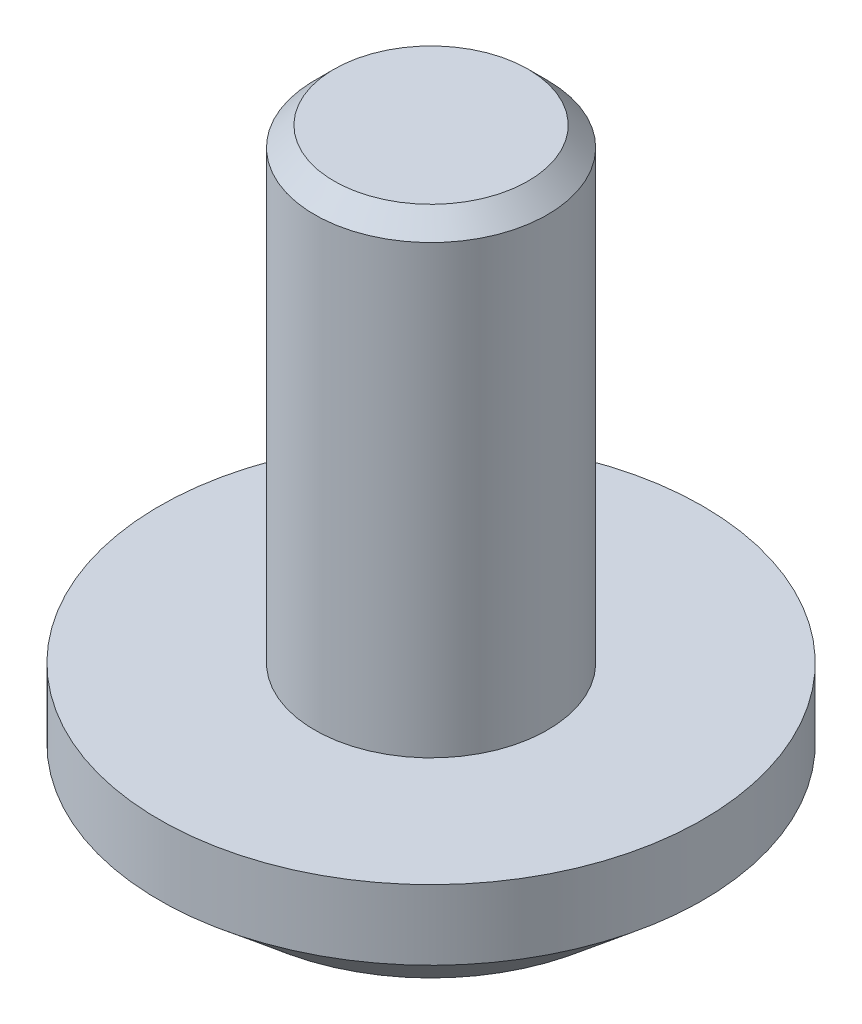
ISO-10303-21;
HEADER;
FILE_DESCRIPTION(('STEP AP214'),'2;1');
FILE_NAME('part.step','',(''),(''),'','','');
FILE_SCHEMA(('AUTOMOTIVE_DESIGN { 1 0 10303 214 1 1 1 1 }'));
ENDSEC;
DATA;
#1=APPLICATION_CONTEXT('core data for automotive mechanical design processes');
#2=APPLICATION_PROTOCOL_DEFINITION('international standard','automotive_design',2000,#1);
#3=PRODUCT_CONTEXT('',#1,'mechanical');
#4=PRODUCT('Part','Part','',(#3));
#5=PRODUCT_RELATED_PRODUCT_CATEGORY('part','',(#4));
#6=PRODUCT_DEFINITION_FORMATION('','',#4);
#7=PRODUCT_DEFINITION_CONTEXT('part definition',#1,'design');
#8=PRODUCT_DEFINITION('design','',#6,#7);
#9=PRODUCT_DEFINITION_SHAPE('','',#8);
#10=(LENGTH_UNIT() NAMED_UNIT(*) SI_UNIT(.MILLI.,.METRE.));
#11=(NAMED_UNIT(*) PLANE_ANGLE_UNIT() SI_UNIT($,.RADIAN.));
#12=(NAMED_UNIT(*) SI_UNIT($,.STERADIAN.) SOLID_ANGLE_UNIT());
#13=UNCERTAINTY_MEASURE_WITH_UNIT(LENGTH_MEASURE(1.E-05),#10,'distance_accuracy_value','');
#14=(GEOMETRIC_REPRESENTATION_CONTEXT(3) GLOBAL_UNCERTAINTY_ASSIGNED_CONTEXT((#13)) GLOBAL_UNIT_ASSIGNED_CONTEXT((#10,
#11,#12)) REPRESENTATION_CONTEXT('',''));
#15=CARTESIAN_POINT('',(0.,0.,0.));
#16=DIRECTION('',(0.,0.,1.));
#17=DIRECTION('',(1.,0.,0.));
#18=AXIS2_PLACEMENT_3D('',#15,#16,#17);
#19=CARTESIAN_POINT('',(3.5,0.,0.));
#20=DIRECTION('',(0.,1.,0.));
#21=DIRECTION('',(0.,0.,1.));
#22=AXIS2_PLACEMENT_3D('',#19,#20,#21);
#23=PLANE('',#22);
#24=CARTESIAN_POINT('',(0.,0.,0.));
#25=DIRECTION('',(0.,-1.,0.));
#26=DIRECTION('',(0.,0.,-1.));
#27=AXIS2_PLACEMENT_3D('',#24,#25,#26);
#28=CIRCLE('',#27,1.5);
#29=CARTESIAN_POINT('',(0.,0.,-1.5));
#30=VERTEX_POINT('',#29);
#31=EDGE_CURVE('E143',#30,#30,#28,.T.);
#32=ORIENTED_EDGE('',*,*,#31,.T.);
#33=EDGE_LOOP('',(#32));
#34=FACE_BOUND('',#33,.T.);
#35=CARTESIAN_POINT('',(0.,0.,0.));
#36=DIRECTION('',(0.,-1.,0.));
#37=DIRECTION('',(0.,0.,-1.));
#38=AXIS2_PLACEMENT_3D('',#35,#36,#37);
#39=CIRCLE('',#38,3.5);
#40=CARTESIAN_POINT('',(0.,0.,-3.5));
#41=VERTEX_POINT('',#40);
#42=EDGE_CURVE('E11',#41,#41,#39,.T.);
#43=ORIENTED_EDGE('',*,*,#42,.F.);
#44=EDGE_LOOP('',(#43));
#45=FACE_BOUND('',#44,.T.);
#46=ADVANCED_FACE('F35',(#34,#45),#23,.T.);
#47=CARTESIAN_POINT('',(0.,0.,0.));
#48=DIRECTION('',(0.,-1.,0.));
#49=DIRECTION('',(0.,0.,-1.));
#50=AXIS2_PLACEMENT_3D('',#47,#48,#49);
#51=CYLINDRICAL_SURFACE('',#50,3.5);
#52=ORIENTED_EDGE('',*,*,#42,.T.);
#53=EDGE_LOOP('',(#52));
#54=FACE_BOUND('',#53,.T.);
#55=CARTESIAN_POINT('',(0.,-0.9,0.));
#56=DIRECTION('',(0.,-1.,0.));
#57=DIRECTION('',(0.,0.,-1.));
#58=AXIS2_PLACEMENT_3D('',#55,#56,#57);
#59=CIRCLE('',#58,3.5);
#60=CARTESIAN_POINT('',(0.,-0.9,-3.5));
#61=VERTEX_POINT('',#60);
#62=EDGE_CURVE('E42',#61,#61,#59,.T.);
#63=ORIENTED_EDGE('',*,*,#62,.F.);
#64=EDGE_LOOP('',(#63));
#65=FACE_BOUND('',#64,.T.);
#66=ADVANCED_FACE('F212',(#54,#65),#51,.T.);
#67=CARTESIAN_POINT('',(0.,-1.8,0.));
#68=DIRECTION('',(0.,1.,0.));
#69=DIRECTION('',(0.,0.,1.));
#70=AXIS2_PLACEMENT_3D('',#67,#68,#69);
#71=CONICAL_SURFACE('',#70,2.42742176666521,0.872664625997166);
#72=ORIENTED_EDGE('',*,*,#62,.T.);
#73=EDGE_LOOP('',(#72));
#74=FACE_BOUND('',#73,.T.);
#75=CARTESIAN_POINT('',(0.,-1.8,0.));
#76=DIRECTION('',(0.,-1.,0.));
#77=DIRECTION('',(0.,0.,-1.));
#78=AXIS2_PLACEMENT_3D('',#75,#76,#77);
#79=CIRCLE('',#78,2.42742176666521);
#80=CARTESIAN_POINT('',(0.,-1.8,-2.42742176666521));
#81=VERTEX_POINT('',#80);
#82=EDGE_CURVE('E227',#81,#81,#79,.T.);
#83=ORIENTED_EDGE('',*,*,#82,.F.);
#84=EDGE_LOOP('',(#83));
#85=FACE_BOUND('',#84,.T.);
#86=ADVANCED_FACE('F217',(#74,#85),#71,.T.);
#87=CARTESIAN_POINT('',(1.,-1.8,0.));
#88=DIRECTION('',(0.,-1.,0.));
#89=DIRECTION('',(0.,0.,-1.));
#90=AXIS2_PLACEMENT_3D('',#87,#88,#89);
#91=PLANE('',#90);
#92=DIRECTION('',(0.5,0.,-0.866025403784438));
#93=VECTOR('',#92,1.);
#94=CARTESIAN_POINT('',(-1.15470053837925,-1.8,0.));
#95=LINE('',#94,#93);
#96=CARTESIAN_POINT('',(-1.15470053837925,-1.8,0.));
#97=VERTEX_POINT('',#96);
#98=CARTESIAN_POINT('',(-0.577350269189624,-1.8,-1.));
#99=VERTEX_POINT('',#98);
#100=EDGE_CURVE('E121',#97,#99,#95,.T.);
#101=ORIENTED_EDGE('',*,*,#100,.F.);
#102=DIRECTION('',(-0.499999999999999,0.,-0.866025403784439));
#103=VECTOR('',#102,1.);
#104=CARTESIAN_POINT('',(-0.577350269189626,-1.8,1.));
#105=LINE('',#104,#103);
#106=CARTESIAN_POINT('',(-0.577350269189626,-1.8,1.));
#107=VERTEX_POINT('',#106);
#108=EDGE_CURVE('E116',#107,#97,#105,.T.);
#109=ORIENTED_EDGE('',*,*,#108,.F.);
#110=DIRECTION('',(-1.,0.,0.));
#111=VECTOR('',#110,1.);
#112=CARTESIAN_POINT('',(0.577350269189626,-1.8,1.));
#113=LINE('',#112,#111);
#114=CARTESIAN_POINT('',(0.577350269189626,-1.8,1.));
#115=VERTEX_POINT('',#114);
#116=EDGE_CURVE('E114',#115,#107,#113,.T.);
#117=ORIENTED_EDGE('',*,*,#116,.F.);
#118=DIRECTION('',(-0.5,0.,0.866025403784438));
#119=VECTOR('',#118,1.);
#120=CARTESIAN_POINT('',(1.15470053837925,-1.8,0.));
#121=LINE('',#120,#119);
#122=CARTESIAN_POINT('',(1.15470053837925,-1.8,0.));
#123=VERTEX_POINT('',#122);
#124=EDGE_CURVE('E99',#123,#115,#121,.T.);
#125=ORIENTED_EDGE('',*,*,#124,.F.);
#126=DIRECTION('',(0.5,0.,0.866025403784439));
#127=VECTOR('',#126,1.);
#128=CARTESIAN_POINT('',(0.577350269189625,-1.8,-1.));
#129=LINE('',#128,#127);
#130=CARTESIAN_POINT('',(0.577350269189625,-1.8,-1.));
#131=VERTEX_POINT('',#130);
#132=EDGE_CURVE('E91',#131,#123,#129,.T.);
#133=ORIENTED_EDGE('',*,*,#132,.F.);
#134=DIRECTION('',(1.,0.,0.));
#135=VECTOR('',#134,1.);
#136=CARTESIAN_POINT('',(-0.577350269189624,-1.8,-1.));
#137=LINE('',#136,#135);
#138=EDGE_CURVE('E107',#99,#131,#137,.T.);
#139=ORIENTED_EDGE('',*,*,#138,.F.);
#140=EDGE_LOOP('',(#101,#109,#117,#125,#133,#139));
#141=FACE_BOUND('',#140,.T.);
#142=ORIENTED_EDGE('',*,*,#82,.T.);
#143=EDGE_LOOP('',(#142));
#144=FACE_BOUND('',#143,.T.);
#145=ADVANCED_FACE('F111',(#141,#144),#91,.T.);
#146=CARTESIAN_POINT('',(1.25,6.,0.));
#147=DIRECTION('',(0.,1.,0.));
#148=DIRECTION('',(0.,0.,1.));
#149=AXIS2_PLACEMENT_3D('',#146,#147,#148);
#150=PLANE('',#149);
#151=CARTESIAN_POINT('',(0.,6.00000000000001,0.));
#152=DIRECTION('',(0.,-1.,0.));
#153=DIRECTION('',(0.,0.,-1.));
#154=AXIS2_PLACEMENT_3D('',#151,#152,#153);
#155=CIRCLE('',#154,1.25);
#156=CARTESIAN_POINT('',(0.,6.00000000000001,-1.25));
#157=VERTEX_POINT('',#156);
#158=EDGE_CURVE('E229',#157,#157,#155,.T.);
#159=ORIENTED_EDGE('',*,*,#158,.F.);
#160=EDGE_LOOP('',(#159));
#161=FACE_BOUND('',#160,.T.);
#162=ADVANCED_FACE('F153',(#161),#150,.T.);
#163=CARTESIAN_POINT('',(0.,5.75000000000001,0.));
#164=DIRECTION('',(0.,-1.,0.));
#165=DIRECTION('',(0.,0.,-1.));
#166=AXIS2_PLACEMENT_3D('',#163,#164,#165);
#167=CONICAL_SURFACE('',#166,1.5,0.785398163397451);
#168=ORIENTED_EDGE('',*,*,#158,.T.);
#169=EDGE_LOOP('',(#168));
#170=FACE_BOUND('',#169,.T.);
#171=CARTESIAN_POINT('',(0.,5.75000000000001,0.));
#172=DIRECTION('',(0.,-1.,0.));
#173=DIRECTION('',(0.,0.,-1.));
#174=AXIS2_PLACEMENT_3D('',#171,#172,#173);
#175=CIRCLE('',#174,1.5);
#176=CARTESIAN_POINT('',(0.,5.75000000000001,-1.5));
#177=VERTEX_POINT('',#176);
#178=EDGE_CURVE('E233',#177,#177,#175,.T.);
#179=ORIENTED_EDGE('',*,*,#178,.F.);
#180=EDGE_LOOP('',(#179));
#181=FACE_BOUND('',#180,.T.);
#182=ADVANCED_FACE('F240',(#170,#181),#167,.T.);
#183=CARTESIAN_POINT('',(0.,0.,0.));
#184=DIRECTION('',(0.,-1.,0.));
#185=DIRECTION('',(0.,0.,-1.));
#186=AXIS2_PLACEMENT_3D('',#183,#184,#185);
#187=CYLINDRICAL_SURFACE('',#186,1.5);
#188=ORIENTED_EDGE('',*,*,#178,.T.);
#189=EDGE_LOOP('',(#188));
#190=FACE_BOUND('',#189,.T.);
#191=ORIENTED_EDGE('',*,*,#31,.F.);
#192=EDGE_LOOP('',(#191));
#193=FACE_BOUND('',#192,.T.);
#194=ADVANCED_FACE('F237',(#190,#193),#187,.T.);
#195=CARTESIAN_POINT('',(0.577350269189625,6.00100000000001,-1.));
#196=DIRECTION('',(0.866025403784439,0.,-0.5));
#197=DIRECTION('',(-0.5,0.,-0.866025403784439));
#198=AXIS2_PLACEMENT_3D('',#195,#196,#197);
#199=PLANE('',#198);
#200=CARTESIAN_POINT('',(1.15481600843309,-0.69388347209622,0.000200000000001371));
#201=CARTESIAN_POINT('',(1.12935116507601,-0.678574054678851,-0.0439064025012375));
#202=CARTESIAN_POINT('',(1.10364823852246,-0.664643761228163,-0.0884251771952017));
#203=CARTESIAN_POINT('',(1.05175857468391,-0.640333828714838,-0.178300711351248));
#204=CARTESIAN_POINT('',(1.02557073497703,-0.629963705287344,-0.223659380264023));
#205=CARTESIAN_POINT('',(0.973546893087115,-0.613875336354571,-0.31376731762229));
#206=CARTESIAN_POINT('',(0.94772030919404,-0.608039719442057,-0.358500273111036));
#207=CARTESIAN_POINT('',(0.895938231071125,-0.601142844130341,-0.448189463341424));
#208=CARTESIAN_POINT('',(0.869982960183025,-0.600075097309466,-0.493145311243828));
#209=CARTESIAN_POINT('',(0.821705437320401,-0.602617287676173,-0.57676443370546));
#210=CARTESIAN_POINT('',(0.799374231868309,-0.605604393337727,-0.615443216142743));
#211=CARTESIAN_POINT('',(0.754870072437484,-0.614965329138089,-0.692526681425077));
#212=CARTESIAN_POINT('',(0.732697301384317,-0.621342581999255,-0.730931047433756));
#213=CARTESIAN_POINT('',(0.688096323417004,-0.637244998769298,-0.808182207340403));
#214=CARTESIAN_POINT('',(0.66567466585189,-0.646841715958213,-0.847017657433091));
#215=CARTESIAN_POINT('',(0.621191001095898,-0.668584663525804,-0.92406562489733));
#216=CARTESIAN_POINT('',(0.599128326097928,-0.680725385766627,-0.962279298944692));
#217=CARTESIAN_POINT('',(0.577234799135787,-0.69388347209622,-1.0002));
#218=B_SPLINE_CURVE_WITH_KNOTS('',3,(#200,#201,#202,#203,#204,#205,#206,#207,#208,#209,#210,
#211,#212,#213,#214,#215,#216,#217),.UNSPECIFIED.,.F.,.F.,(4,2,2,2,2,2,2,2,4),(0.,
0.159613304541429,0.319649961981406,0.475391802512406,0.63092163489542,0.765071895662006,
0.899357853653454,1.036851401977,1.17405027728441),.UNSPECIFIED.);
#219=CARTESIAN_POINT('',(1.15470053837925,-0.693814080282021,0.));
#220=VERTEX_POINT('',#219);
#221=CARTESIAN_POINT('',(0.577350269189625,-0.693814080282021,-1.));
#222=VERTEX_POINT('',#221);
#223=EDGE_CURVE('E65',#220,#222,#218,.T.);
#224=ORIENTED_EDGE('',*,*,#223,.T.);
#225=DIRECTION('',(0.,-1.,0.));
#226=VECTOR('',#225,1.);
#227=CARTESIAN_POINT('',(0.577350269189625,6.00100000000001,-1.));
#228=LINE('',#227,#226);
#229=EDGE_CURVE('E96',#222,#131,#228,.T.);
#230=ORIENTED_EDGE('',*,*,#229,.T.);
#231=ORIENTED_EDGE('',*,*,#132,.T.);
#232=DIRECTION('',(0.,-1.,0.));
#233=VECTOR('',#232,1.);
#234=CARTESIAN_POINT('',(1.15470053837925,6.00100000000001,0.));
#235=LINE('',#234,#233);
#236=EDGE_CURVE('E94',#220,#123,#235,.T.);
#237=ORIENTED_EDGE('',*,*,#236,.F.);
#238=EDGE_LOOP('',(#224,#230,#231,#237));
#239=FACE_BOUND('',#238,.T.);
#240=ADVANCED_FACE('F93',(#239),#199,.F.);
#241=CARTESIAN_POINT('',(-0.577350269189624,6.00100000000001,-1.));
#242=DIRECTION('',(0.,0.,-1.));
#243=DIRECTION('',(-1.,0.,0.));
#244=AXIS2_PLACEMENT_3D('',#241,#242,#243);
#245=PLANE('',#244);
#246=CARTESIAN_POINT('',(-1.53904163064329,-1.102812374797,-1.));
#247=CARTESIAN_POINT('',(-1.49559868755923,-1.08092771612838,-1.));
#248=CARTESIAN_POINT('',(-1.45204895677684,-1.05925605573784,-1.));
#249=CARTESIAN_POINT('',(-1.36467744401215,-1.01644977105509,-1.));
#250=CARTESIAN_POINT('',(-1.32085561695099,-0.99531523887314,-1.));
#251=CARTESIAN_POINT('',(-1.18839686855364,-0.932649222950173,-1.));
#252=CARTESIAN_POINT('',(-1.09927882184264,-0.892116691720137,-1.));
#253=CARTESIAN_POINT('',(-0.916320996934893,-0.81401396097966,-1.));
#254=CARTESIAN_POINT('',(-0.822421660944541,-0.776581614078553,-1.));
#255=CARTESIAN_POINT('',(-0.632045972994543,-0.709315961542934,-1.));
#256=CARTESIAN_POINT('',(-0.53557688606993,-0.679463320588612,-1.));
#257=CARTESIAN_POINT('',(-0.388814063806206,-0.644126310415077,-1.));
#258=CARTESIAN_POINT('',(-0.33966933071893,-0.633934094432695,-1.));
#259=CARTESIAN_POINT('',(-0.240730099304215,-0.617366403352343,-1.));
#260=CARTESIAN_POINT('',(-0.190935694294077,-0.610990386139744,-1.));
#261=CARTESIAN_POINT('',(-0.091660831726607,-0.602667776721385,-1.));
#262=CARTESIAN_POINT('',(-0.042185547416753,-0.600661181034174,-1.));
#263=CARTESIAN_POINT('',(0.056747455621532,-0.601091909505653,-1.));
#264=CARTESIAN_POINT('',(0.106205172323366,-0.603529641155466,-1.));
#265=CARTESIAN_POINT('',(0.221951971741998,-0.61421813084129,-1.));
#266=CARTESIAN_POINT('',(0.288080317021914,-0.624203241497851,-1.));
#267=CARTESIAN_POINT('',(0.419101282650496,-0.650429590018154,-1.));
#268=CARTESIAN_POINT('',(0.483992495828542,-0.666677552297167,-1.));
#269=CARTESIAN_POINT('',(0.58111704449707,-0.694732702943994,-1.));
#270=CARTESIAN_POINT('',(0.613858719493795,-0.704846850435661,-1.));
#271=CARTESIAN_POINT('',(0.678990353396093,-0.72609217699882,-1.));
#272=CARTESIAN_POINT('',(0.711380506687132,-0.737222758181995,-1.));
#273=CARTESIAN_POINT('',(0.775850420488813,-0.760337908226058,-1.));
#274=CARTESIAN_POINT('',(0.807930198016002,-0.772322429964312,-1.));
#275=CARTESIAN_POINT('',(0.871815728524172,-0.797010756963093,-1.));
#276=CARTESIAN_POINT('',(0.90362144382917,-0.809714659356745,-1.));
#277=CARTESIAN_POINT('',(1.01057922120233,-0.853609506228236,-1.));
#278=CARTESIAN_POINT('',(1.08516185107213,-0.886187658247517,-1.));
#279=CARTESIAN_POINT('',(1.23330776506518,-0.953594315419665,-1.));
#280=CARTESIAN_POINT('',(1.30687080677786,-0.988423344946901,-1.));
#281=CARTESIAN_POINT('',(1.45327937911939,-1.05965915150712,-1.));
#282=CARTESIAN_POINT('',(1.52612446434344,-1.09606684053193,-1.));
#283=CARTESIAN_POINT('',(1.67124779014992,-1.16999749921556,-1.));
#284=CARTESIAN_POINT('',(1.74352600514082,-1.20752051886418,-1.));
#285=CARTESIAN_POINT('',(1.96007805307974,-1.32148238078466,-1.));
#286=CARTESIAN_POINT('',(2.10371138625421,-1.39913577851613,-1.));
#287=CARTESIAN_POINT('',(2.38990388639959,-1.55625434317741,-1.));
#288=CARTESIAN_POINT('',(2.53246344071262,-1.63571881061637,-1.));
#289=CARTESIAN_POINT('',(2.7957904658655,-1.78392419250091,-1.));
#290=CARTESIAN_POINT('',(2.91664863282179,-1.8525041381572,-1.));
#291=CARTESIAN_POINT('',(3.1580364780484,-1.99027077657687,-1.));
#292=CARTESIAN_POINT('',(3.27856611711171,-2.05945753793123,-1.));
#293=CARTESIAN_POINT('',(3.51883035799494,-2.19795261514841,-1.));
#294=CARTESIAN_POINT('',(3.63856609147717,-2.26725896949959,-0.999999999999999));
#295=CARTESIAN_POINT('',(3.87783041321978,-2.40619368867204,-0.999999999999999));
#296=CARTESIAN_POINT('',(3.99735902575235,-2.47582201167998,-0.999999999999999));
#297=CARTESIAN_POINT('',(4.11682001916183,-2.54556550123758,-0.999999999999999));
#298=B_SPLINE_CURVE_WITH_KNOTS('',3,(#246,#247,#248,#249,#250,#251,#252,#253,#254,#255,#256,
#257,#258,#259,#260,#261,#262,#263,#264,#265,#266,#267,#268,#269,#270,#271,#272,#273,#274,#275,
#276,#277,#278,#279,#280,#281,#282,#283,#284,#285,#286,#287,#288,#289,#290,#291,#292,#293,#294,
#295,#296,#297),.UNSPECIFIED.,.F.,.F.,(4,2,2,2,2,2,2,2,2,2,2,2,2,2,2,2,2,2,2,2,2,2,2,2,2,4),(0.,
0.145929347898446,0.291883554127038,0.585516432602231,0.888627449277913,1.19095730073233,
1.34140768069261,1.49183668317052,1.64018652344805,1.7885499662977,1.98878338300681,
2.18923239163546,2.2920242761367,2.39475608098353,2.49748222120926,2.6002222650813,
2.84431825436247,3.08847131575496,3.33276735424782,3.57707435879714,4.06688753738432,
4.55651463791474,4.97339235863523,5.39031782421745,5.80535958381876,6.22034887737473),.UNSPECIFIED.);
#299=CARTESIAN_POINT('',(-0.577350269189624,-0.693814080282021,-1.));
#300=VERTEX_POINT('',#299);
#301=EDGE_CURVE('E181',#222,#300,#298,.F.);
#302=ORIENTED_EDGE('',*,*,#301,.T.);
#303=DIRECTION('',(0.,-1.,0.));
#304=VECTOR('',#303,1.);
#305=CARTESIAN_POINT('',(-0.577350269189624,6.00100000000001,-1.));
#306=LINE('',#305,#304);
#307=EDGE_CURVE('E126',#300,#99,#306,.T.);
#308=ORIENTED_EDGE('',*,*,#307,.T.);
#309=ORIENTED_EDGE('',*,*,#138,.T.);
#310=ORIENTED_EDGE('',*,*,#229,.F.);
#311=EDGE_LOOP('',(#302,#308,#309,#310));
#312=FACE_BOUND('',#311,.T.);
#313=ADVANCED_FACE('F192',(#312),#245,.F.);
#314=CARTESIAN_POINT('',(-1.15470053837925,6.00100000000001,0.));
#315=DIRECTION('',(-0.866025403784438,0.,-0.5));
#316=DIRECTION('',(-0.5,0.,0.866025403784439));
#317=AXIS2_PLACEMENT_3D('',#314,#315,#316);
#318=PLANE('',#317);
#319=CARTESIAN_POINT('',(-0.577234799135786,-0.69388347209622,-1.0002));
#320=CARTESIAN_POINT('',(-0.602699642492863,-0.678574054678851,-0.956093597498762));
#321=CARTESIAN_POINT('',(-0.628402569046415,-0.664643761228163,-0.911574822804797));
#322=CARTESIAN_POINT('',(-0.68029223288497,-0.640333828714838,-0.821699288648751));
#323=CARTESIAN_POINT('',(-0.706480072591844,-0.629963705287344,-0.776340619735976));
#324=CARTESIAN_POINT('',(-0.758503914481761,-0.613875336354571,-0.686232682377709));
#325=CARTESIAN_POINT('',(-0.784330498374836,-0.608039719442057,-0.641499726888964));
#326=CARTESIAN_POINT('',(-0.83611257649775,-0.601142844130341,-0.551810536658575));
#327=CARTESIAN_POINT('',(-0.862067847385851,-0.600075097309465,-0.506854688756171));
#328=CARTESIAN_POINT('',(-0.910345370248475,-0.602617287676173,-0.423235566294539));
#329=CARTESIAN_POINT('',(-0.932676575700567,-0.605604393337727,-0.384556783857257));
#330=CARTESIAN_POINT('',(-0.977180735131392,-0.614965329138089,-0.307473318574922));
#331=CARTESIAN_POINT('',(-0.999353506184559,-0.621342581999255,-0.269068952566244));
#332=CARTESIAN_POINT('',(-1.04395448415187,-0.637244998769298,-0.191817792659597));
#333=CARTESIAN_POINT('',(-1.06637614171699,-0.646841715958213,-0.152982342566909));
#334=CARTESIAN_POINT('',(-1.11085980647298,-0.668584663525804,-0.0759343751026704));
#335=CARTESIAN_POINT('',(-1.13292248147095,-0.680725385766627,-0.0377207010553078));
#336=CARTESIAN_POINT('',(-1.15481600843309,-0.693883472096219,0.000199999999999501));
#337=B_SPLINE_CURVE_WITH_KNOTS('',3,(#319,#320,#321,#322,#323,#324,#325,#326,#327,#328,#329,
#330,#331,#332,#333,#334,#335,#336),.UNSPECIFIED.,.F.,.F.,(4,2,2,2,2,2,2,2,4),(0.,
0.159613304541429,0.319649961981406,0.475391802512406,0.630921634895419,0.765071895662005,
0.899357853653454,1.036851401977,1.1740502772844),.UNSPECIFIED.);
#338=CARTESIAN_POINT('',(-1.15470053837925,-0.693814080282021,0.));
#339=VERTEX_POINT('',#338);
#340=EDGE_CURVE('E174',#300,#339,#337,.T.);
#341=ORIENTED_EDGE('',*,*,#340,.T.);
#342=DIRECTION('',(0.,-1.,0.));
#343=VECTOR('',#342,1.);
#344=CARTESIAN_POINT('',(-1.15470053837925,6.00100000000001,0.));
#345=LINE('',#344,#343);
#346=EDGE_CURVE('E129',#339,#97,#345,.T.);
#347=ORIENTED_EDGE('',*,*,#346,.T.);
#348=ORIENTED_EDGE('',*,*,#100,.T.);
#349=ORIENTED_EDGE('',*,*,#307,.F.);
#350=EDGE_LOOP('',(#341,#347,#348,#349));
#351=FACE_BOUND('',#350,.T.);
#352=ADVANCED_FACE('F195',(#351),#318,.F.);
#353=CARTESIAN_POINT('',(-0.577350269189626,6.00100000000001,1.));
#354=DIRECTION('',(-0.866025403784439,0.,0.499999999999999));
#355=DIRECTION('',(0.5,0.,0.866025403784439));
#356=AXIS2_PLACEMENT_3D('',#353,#354,#355);
#357=PLANE('',#356);
#358=CARTESIAN_POINT('',(-1.15481600843309,-0.69388347209622,-0.000200000000000407));
#359=CARTESIAN_POINT('',(-1.12935116507601,-0.678574054678851,0.0439064025012383));
#360=CARTESIAN_POINT('',(-1.10364823852246,-0.664643761228163,0.0884251771952025));
#361=CARTESIAN_POINT('',(-1.05175857468391,-0.640333828714838,0.178300711351249));
#362=CARTESIAN_POINT('',(-1.02557073497703,-0.629963705287344,0.223659380264024));
#363=CARTESIAN_POINT('',(-0.973546893087114,-0.613875336354571,0.31376731762229));
#364=CARTESIAN_POINT('',(-0.947720309194039,-0.608039719442057,0.358500273111036));
#365=CARTESIAN_POINT('',(-0.895938231071125,-0.601142844130341,0.448189463341425));
#366=CARTESIAN_POINT('',(-0.869982960183024,-0.600075097309466,0.493145311243829));
#367=CARTESIAN_POINT('',(-0.821705437320401,-0.602617287676173,0.576764433705461));
#368=CARTESIAN_POINT('',(-0.799374231868309,-0.605604393337727,0.615443216142743));
#369=CARTESIAN_POINT('',(-0.754870072437484,-0.614965329138089,0.692526681425078));
#370=CARTESIAN_POINT('',(-0.732697301384317,-0.621342581999255,0.730931047433756));
#371=CARTESIAN_POINT('',(-0.688096323417004,-0.637244998769298,0.808182207340403));
#372=CARTESIAN_POINT('',(-0.66567466585189,-0.646841715958214,0.847017657433091));
#373=CARTESIAN_POINT('',(-0.621191001095898,-0.668584663525804,0.92406562489733));
#374=CARTESIAN_POINT('',(-0.599128326097929,-0.680725385766627,0.962279298944692));
#375=CARTESIAN_POINT('',(-0.577234799135788,-0.69388347209622,1.0002));
#376=B_SPLINE_CURVE_WITH_KNOTS('',3,(#358,#359,#360,#361,#362,#363,#364,#365,#366,#367,#368,
#369,#370,#371,#372,#373,#374,#375),.UNSPECIFIED.,.F.,.F.,(4,2,2,2,2,2,2,2,4),(0.,
0.159613304541429,0.319649961981406,0.475391802512406,0.630921634895419,0.765071895662005,
0.899357853653453,1.036851401977,1.1740502772844),.UNSPECIFIED.);
#377=CARTESIAN_POINT('',(-0.577350269190014,-0.693814080281777,1.));
#378=VERTEX_POINT('',#377);
#379=EDGE_CURVE('E167',#339,#378,#376,.T.);
#380=ORIENTED_EDGE('',*,*,#379,.T.);
#381=DIRECTION('',(0.,-1.,0.));
#382=VECTOR('',#381,1.);
#383=CARTESIAN_POINT('',(-0.577350269189626,6.00100000000001,1.));
#384=LINE('',#383,#382);
#385=EDGE_CURVE('E132',#378,#107,#384,.T.);
#386=ORIENTED_EDGE('',*,*,#385,.T.);
#387=ORIENTED_EDGE('',*,*,#108,.T.);
#388=ORIENTED_EDGE('',*,*,#346,.F.);
#389=EDGE_LOOP('',(#380,#386,#387,#388));
#390=FACE_BOUND('',#389,.T.);
#391=ADVANCED_FACE('F199',(#390),#357,.F.);
#392=CARTESIAN_POINT('',(0.577350269189626,6.00100000000001,1.));
#393=DIRECTION('',(0.,0.,1.));
#394=DIRECTION('',(1.,0.,0.));
#395=AXIS2_PLACEMENT_3D('',#392,#393,#394);
#396=PLANE('',#395);
#397=CARTESIAN_POINT('',(-1.53904163064122,-1.10281237479596,1.));
#398=CARTESIAN_POINT('',(-1.49559868755717,-1.08092771612735,1.));
#399=CARTESIAN_POINT('',(-1.45204895677479,-1.05925605573682,1.));
#400=CARTESIAN_POINT('',(-1.36467744401011,-1.0164497710541,1.));
#401=CARTESIAN_POINT('',(-1.32085561694897,-0.995315238872169,1.));
#402=CARTESIAN_POINT('',(-1.18839686855163,-0.932649222949248,1.));
#403=CARTESIAN_POINT('',(-1.09927882184064,-0.892116691719246,1.));
#404=CARTESIAN_POINT('',(-0.916320996932934,-0.814013960978863,1.));
#405=CARTESIAN_POINT('',(-0.822421660942613,-0.776581614077814,1.));
#406=CARTESIAN_POINT('',(-0.632045972992673,-0.70931596154233,1.));
#407=CARTESIAN_POINT('',(-0.535576886068088,-0.679463320588086,1.));
#408=CARTESIAN_POINT('',(-0.388814063804403,-0.644126310414683,1.));
#409=CARTESIAN_POINT('',(-0.339669330717136,-0.633934094432347,1.));
#410=CARTESIAN_POINT('',(-0.24073009930244,-0.617366403352092,1.));
#411=CARTESIAN_POINT('',(-0.190935694292312,-0.610990386139545,1.));
#412=CARTESIAN_POINT('',(-0.0916608317248664,-0.602667776721289,1.));
#413=CARTESIAN_POINT('',(-0.0421855474150252,-0.600661181034131,1.));
#414=CARTESIAN_POINT('',(0.0567474556232296,-0.601091909505712,1.));
#415=CARTESIAN_POINT('',(0.106205172325046,-0.603529641155574,1.));
#416=CARTESIAN_POINT('',(0.221951971743768,-0.614218130841517,1.));
#417=CARTESIAN_POINT('',(0.288080317023788,-0.624203241498161,1.));
#418=CARTESIAN_POINT('',(0.419101282652571,-0.650429590018635,1.));
#419=CARTESIAN_POINT('',(0.483992495830714,-0.666677552297735,1.));
#420=CARTESIAN_POINT('',(0.581117044499386,-0.694732702944693,1.));
#421=CARTESIAN_POINT('',(0.613858719496159,-0.704846850436404,1.));
#422=CARTESIAN_POINT('',(0.678990353398553,-0.72609217699965,1.));
#423=CARTESIAN_POINT('',(0.711380506689639,-0.737222758182869,1.));
#424=CARTESIAN_POINT('',(0.775850420491415,-0.760337908227017,1.));
#425=CARTESIAN_POINT('',(0.80793019801865,-0.772322429965312,1.));
#426=CARTESIAN_POINT('',(0.871815728526915,-0.797010756964176,1.));
#427=CARTESIAN_POINT('',(0.90362144383196,-0.80971465935787,1.));
#428=CARTESIAN_POINT('',(1.01057922120537,-0.853609506229536,1.));
#429=CARTESIAN_POINT('',(1.08516185107538,-0.886187658248955,1.));
#430=CARTESIAN_POINT('',(1.23330776506884,-0.953594315421377,1.));
#431=CARTESIAN_POINT('',(1.30687080678174,-0.98842334494875,1.));
#432=CARTESIAN_POINT('',(1.45327937912368,-1.05965915150924,1.));
#433=CARTESIAN_POINT('',(1.52612446434793,-1.09606684053419,1.));
#434=CARTESIAN_POINT('',(1.67124779015482,-1.16999749921809,1.));
#435=CARTESIAN_POINT('',(1.74352600514593,-1.20752051886684,1.));
#436=CARTESIAN_POINT('',(1.96007805308547,-1.32148238078773,1.));
#437=CARTESIAN_POINT('',(2.10371138626036,-1.39913577851947,1.));
#438=CARTESIAN_POINT('',(2.38990388640656,-1.55625434318127,1.));
#439=CARTESIAN_POINT('',(2.53246344072,-1.63571881062049,1.));
#440=CARTESIAN_POINT('',(2.79579046587364,-1.78392419250552,1.));
#441=CARTESIAN_POINT('',(2.91664863283028,-1.85250413816202,1.));
#442=CARTESIAN_POINT('',(3.15803647805757,-1.99027077658213,1.));
#443=CARTESIAN_POINT('',(3.27856611712123,-2.0594575379367,1.));
#444=CARTESIAN_POINT('',(3.51883035800515,-2.19795261515431,1.));
#445=CARTESIAN_POINT('',(3.63856609148773,-2.26725896950571,1.));
#446=CARTESIAN_POINT('',(3.87783041323104,-2.40619368867859,1.));
#447=CARTESIAN_POINT('',(3.99735902576395,-2.47582201168674,1.));
#448=CARTESIAN_POINT('',(4.11682001917378,-2.54556550124455,1.));
#449=B_SPLINE_CURVE_WITH_KNOTS('',3,(#397,#398,#399,#400,#401,#402,#403,#404,#405,#406,#407,
#408,#409,#410,#411,#412,#413,#414,#415,#416,#417,#418,#419,#420,#421,#422,#423,#424,#425,#426,
#427,#428,#429,#430,#431,#432,#433,#434,#435,#436,#437,#438,#439,#440,#441,#442,#443,#444,#445,
#446,#447,#448),.UNSPECIFIED.,.F.,.F.,(4,2,2,2,2,2,2,2,2,2,2,2,2,2,2,2,2,2,2,2,2,2,2,2,2,4),(0.,
0.145929347898407,0.291883554126958,0.585516432602081,0.888627449277615,1.19095730073188,
1.3414076806921,1.49183668316997,1.64018652344745,1.78854996629705,1.98878338300651,
2.1892323916355,2.29202427613692,2.39475608098393,2.49748222120984,2.60022226508205,
2.84431825436395,3.08847131575719,3.33276735425078,3.57707435880083,4.06688753738948,
4.55651463792137,4.97339235864308,5.39031782422652,5.80535958382906,6.22034887738626),.UNSPECIFIED.);
#450=CARTESIAN_POINT('',(0.577350269189626,-0.693814080282022,1.));
#451=VERTEX_POINT('',#450);
#452=EDGE_CURVE('E53',#378,#451,#449,.T.);
#453=ORIENTED_EDGE('',*,*,#452,.T.);
#454=DIRECTION('',(0.,-1.,0.));
#455=VECTOR('',#454,1.);
#456=CARTESIAN_POINT('',(0.577350269189626,6.00100000000001,1.));
#457=LINE('',#456,#455);
#458=EDGE_CURVE('E106',#451,#115,#457,.T.);
#459=ORIENTED_EDGE('',*,*,#458,.T.);
#460=ORIENTED_EDGE('',*,*,#116,.T.);
#461=ORIENTED_EDGE('',*,*,#385,.F.);
#462=EDGE_LOOP('',(#453,#459,#460,#461));
#463=FACE_BOUND('',#462,.T.);
#464=ADVANCED_FACE('F203',(#463),#396,.F.);
#465=CARTESIAN_POINT('',(1.15470053837925,6.00100000000001,0.));
#466=DIRECTION('',(0.866025403784438,0.,0.5));
#467=DIRECTION('',(0.5,0.,-0.866025403784438));
#468=AXIS2_PLACEMENT_3D('',#465,#466,#467);
#469=PLANE('',#468);
#470=CARTESIAN_POINT('',(0.577234799135788,-0.69388347209622,1.0002));
#471=CARTESIAN_POINT('',(0.602699642492864,-0.678574054678851,0.956093597498761));
#472=CARTESIAN_POINT('',(0.628402569046416,-0.664643761228163,0.911574822804797));
#473=CARTESIAN_POINT('',(0.680292232884971,-0.640333828714838,0.821699288648751));
#474=CARTESIAN_POINT('',(0.706480072591845,-0.629963705287344,0.776340619735976));
#475=CARTESIAN_POINT('',(0.758503914481762,-0.613875336354571,0.686232682377709));
#476=CARTESIAN_POINT('',(0.784330498374837,-0.608039719442057,0.641499726888963));
#477=CARTESIAN_POINT('',(0.836112576497752,-0.601142844130342,0.551810536658574));
#478=CARTESIAN_POINT('',(0.862067847385852,-0.600075097309466,0.506854688756171));
#479=CARTESIAN_POINT('',(0.910345370248476,-0.602617287676173,0.423235566294539));
#480=CARTESIAN_POINT('',(0.932676575700568,-0.605604393337727,0.384556783857256));
#481=CARTESIAN_POINT('',(0.977180735131393,-0.61496532913809,0.307473318574922));
#482=CARTESIAN_POINT('',(0.99935350618456,-0.621342581999256,0.269068952566244));
#483=CARTESIAN_POINT('',(1.04395448415187,-0.637244998769298,0.191817792659598));
#484=CARTESIAN_POINT('',(1.06637614171699,-0.646841715958214,0.152982342566909));
#485=CARTESIAN_POINT('',(1.11085980647298,-0.668584663525804,0.0759343751026711));
#486=CARTESIAN_POINT('',(1.13292248147095,-0.680725385766627,0.0377207010553085));
#487=CARTESIAN_POINT('',(1.15481600843309,-0.69388347209622,-0.000199999999998655));
#488=B_SPLINE_CURVE_WITH_KNOTS('',3,(#470,#471,#472,#473,#474,#475,#476,#477,#478,#479,#480,
#481,#482,#483,#484,#485,#486,#487),.UNSPECIFIED.,.F.,.F.,(4,2,2,2,2,2,2,2,4),(0.,
0.159613304541429,0.319649961981406,0.475391802512406,0.63092163489542,0.765071895662005,
0.899357853653453,1.036851401977,1.1740502772844),.UNSPECIFIED.);
#489=EDGE_CURVE('E105',#451,#220,#488,.T.);
#490=ORIENTED_EDGE('',*,*,#489,.T.);
#491=ORIENTED_EDGE('',*,*,#236,.T.);
#492=ORIENTED_EDGE('',*,*,#124,.T.);
#493=ORIENTED_EDGE('',*,*,#458,.F.);
#494=EDGE_LOOP('',(#490,#491,#492,#493));
#495=FACE_BOUND('',#494,.T.);
#496=ADVANCED_FACE('F102',(#495),#469,.F.);
#497=CARTESIAN_POINT('',(0.,0.,0.));
#498=DIRECTION('',(0.,-1.,0.));
#499=DIRECTION('',(0.,0.,-1.));
#500=AXIS2_PLACEMENT_3D('',#497,#498,#499);
#501=CONICAL_SURFACE('',#500,0.,1.02974425867665);
#502=ORIENTED_EDGE('',*,*,#340,.F.);
#503=ORIENTED_EDGE('',*,*,#301,.F.);
#504=ORIENTED_EDGE('',*,*,#223,.F.);
#505=ORIENTED_EDGE('',*,*,#489,.F.);
#506=ORIENTED_EDGE('',*,*,#452,.F.);
#507=ORIENTED_EDGE('',*,*,#379,.F.);
#508=EDGE_LOOP('',(#502,#503,#504,#505,#506,#507));
#509=FACE_BOUND('',#508,.T.);
#510=CARTESIAN_POINT('',(0.,0.,0.));
#511=VERTEX_POINT('',#510);
#512=VERTEX_LOOP('',#511);
#513=FACE_BOUND('',#512,.T.);
#514=ADVANCED_FACE('F148',(#509,#513),#501,.F.);
#515=CLOSED_SHELL('',(#46,#66,#86,#145,#162,#182,#194,#240,#313,#352,#391,#464,#496,#514));
#516=MANIFOLD_SOLID_BREP('B2',#515);
#517=ADVANCED_BREP_SHAPE_REPRESENTATION('',(#18,#516),#14);
#518=SHAPE_DEFINITION_REPRESENTATION(#9,#517);
ENDSEC;
END-ISO-10303-21;
